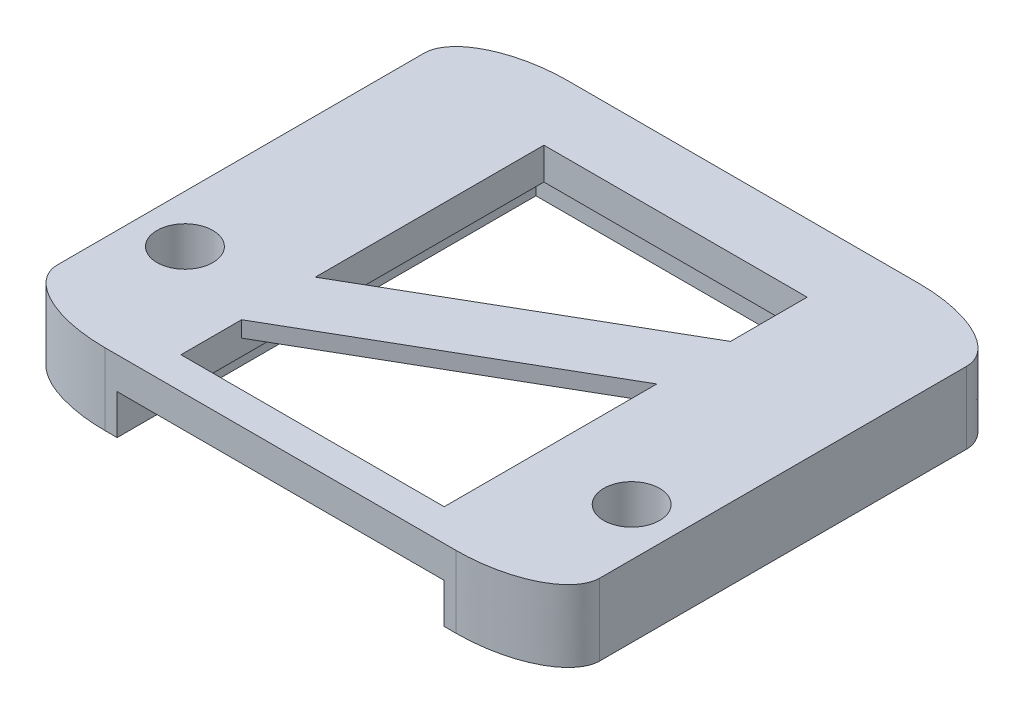
ISO-10303-21;
HEADER;
FILE_DESCRIPTION(('STEP AP214'),'2;1');
FILE_NAME('part.step','',(''),(''),'','','');
FILE_SCHEMA(('AUTOMOTIVE_DESIGN { 1 0 10303 214 1 1 1 1 }'));
ENDSEC;
DATA;
#1=APPLICATION_CONTEXT('core data for automotive mechanical design processes');
#2=APPLICATION_PROTOCOL_DEFINITION('international standard','automotive_design',2000,#1);
#3=PRODUCT_CONTEXT('',#1,'mechanical');
#4=PRODUCT('Part','Part','',(#3));
#5=PRODUCT_RELATED_PRODUCT_CATEGORY('part','',(#4));
#6=PRODUCT_DEFINITION_FORMATION('','',#4);
#7=PRODUCT_DEFINITION_CONTEXT('part definition',#1,'design');
#8=PRODUCT_DEFINITION('design','',#6,#7);
#9=PRODUCT_DEFINITION_SHAPE('','',#8);
#10=(LENGTH_UNIT() NAMED_UNIT(*) SI_UNIT(.MILLI.,.METRE.));
#11=(NAMED_UNIT(*) PLANE_ANGLE_UNIT() SI_UNIT($,.RADIAN.));
#12=(NAMED_UNIT(*) SI_UNIT($,.STERADIAN.) SOLID_ANGLE_UNIT());
#13=UNCERTAINTY_MEASURE_WITH_UNIT(LENGTH_MEASURE(1.E-05),#10,'distance_accuracy_value','');
#14=(GEOMETRIC_REPRESENTATION_CONTEXT(3) GLOBAL_UNCERTAINTY_ASSIGNED_CONTEXT((#13)) GLOBAL_UNIT_ASSIGNED_CONTEXT((#10,
#11,#12)) REPRESENTATION_CONTEXT('',''));
#15=CARTESIAN_POINT('',(0.,0.,0.));
#16=DIRECTION('',(0.,0.,1.));
#17=DIRECTION('',(1.,0.,0.));
#18=AXIS2_PLACEMENT_3D('',#15,#16,#17);
#19=CARTESIAN_POINT('',(1.70364564057485,2.,2.95080080756888));
#20=DIRECTION('',(-0.499999999999997,0.,-0.86602540378444));
#21=DIRECTION('',(-0.86602540378444,0.,0.499999999999997));
#22=AXIS2_PLACEMENT_3D('',#19,#20,#21);
#23=PLANE('',#22);
#24=DIRECTION('',(-0.86602540378444,0.,0.499999999999997));
#25=VECTOR('',#24,1.);
#26=CARTESIAN_POINT('',(1.70364564057485,1.,2.95080080756888));
#27=LINE('',#26,#25);
#28=CARTESIAN_POINT('',(8.25000000000001,1.,-0.828738644055887));
#29=VERTEX_POINT('',#28);
#30=CARTESIAN_POINT('',(-8.25,1.,8.69754079757288));
#31=VERTEX_POINT('',#30);
#32=EDGE_CURVE('E209',#29,#31,#27,.T.);
#33=ORIENTED_EDGE('',*,*,#32,.F.);
#34=DIRECTION('',(0.,-1.,0.));
#35=VECTOR('',#34,1.);
#36=CARTESIAN_POINT('',(8.25000000000001,2.,-0.82873864405589));
#37=LINE('',#36,#35);
#38=CARTESIAN_POINT('',(8.25000000000001,2.,-0.828738644055889));
#39=VERTEX_POINT('',#38);
#40=EDGE_CURVE('E236',#39,#29,#37,.T.);
#41=ORIENTED_EDGE('',*,*,#40,.F.);
#42=DIRECTION('',(0.86602540378444,0.,-0.499999999999997));
#43=VECTOR('',#42,1.);
#44=CARTESIAN_POINT('',(1.70364564057485,2.,2.95080080756888));
#45=LINE('',#44,#43);
#46=CARTESIAN_POINT('',(-8.25,2.,8.69754079757288));
#47=VERTEX_POINT('',#46);
#48=EDGE_CURVE('E234',#47,#39,#45,.T.);
#49=ORIENTED_EDGE('',*,*,#48,.F.);
#50=DIRECTION('',(0.,-1.,0.));
#51=VECTOR('',#50,1.);
#52=CARTESIAN_POINT('',(-8.25,2.,8.69754079757288));
#53=LINE('',#52,#51);
#54=EDGE_CURVE('E228',#47,#31,#53,.T.);
#55=ORIENTED_EDGE('',*,*,#54,.T.);
#56=EDGE_LOOP('',(#33,#41,#49,#55));
#57=FACE_BOUND('',#56,.T.);
#58=ADVANCED_FACE('F64',(#57),#23,.F.);
#59=CARTESIAN_POINT('',(-0.296354359425141,2.,-0.513300807568876));
#60=DIRECTION('',(-0.499999999999998,0.,-0.86602540378444));
#61=DIRECTION('',(-0.86602540378444,0.,0.499999999999998));
#62=AXIS2_PLACEMENT_3D('',#59,#60,#61);
#63=PLANE('',#62);
#64=DIRECTION('',(0.,-1.,0.));
#65=VECTOR('',#64,1.);
#66=CARTESIAN_POINT('',(8.25000000000001,2.,-5.44754079757289));
#67=LINE('',#66,#65);
#68=CARTESIAN_POINT('',(8.25000000000001,2.,-5.44754079757289));
#69=VERTEX_POINT('',#68);
#70=CARTESIAN_POINT('',(8.25000000000001,1.,-5.44754079757289));
#71=VERTEX_POINT('',#70);
#72=EDGE_CURVE('E623',#69,#71,#67,.T.);
#73=ORIENTED_EDGE('',*,*,#72,.T.);
#74=DIRECTION('',(-0.86602540378444,0.,0.499999999999998));
#75=VECTOR('',#74,1.);
#76=CARTESIAN_POINT('',(-0.296354359425141,1.,-0.513300807568876));
#77=LINE('',#76,#75);
#78=CARTESIAN_POINT('',(-8.25,1.,4.07873864405588));
#79=VERTEX_POINT('',#78);
#80=EDGE_CURVE('E221',#71,#79,#77,.T.);
#81=ORIENTED_EDGE('',*,*,#80,.T.);
#82=DIRECTION('',(0.,-1.,0.));
#83=VECTOR('',#82,1.);
#84=CARTESIAN_POINT('',(-8.25,2.,4.07873864405588));
#85=LINE('',#84,#83);
#86=CARTESIAN_POINT('',(-8.25,2.,4.07873864405588));
#87=VERTEX_POINT('',#86);
#88=EDGE_CURVE('E231',#87,#79,#85,.T.);
#89=ORIENTED_EDGE('',*,*,#88,.F.);
#90=DIRECTION('',(0.86602540378444,0.,-0.499999999999998));
#91=VECTOR('',#90,1.);
#92=CARTESIAN_POINT('',(-0.296354359425141,2.,-0.513300807568876));
#93=LINE('',#92,#91);
#94=EDGE_CURVE('E640',#87,#69,#93,.T.);
#95=ORIENTED_EDGE('',*,*,#94,.T.);
#96=EDGE_LOOP('',(#73,#81,#89,#95));
#97=FACE_BOUND('',#96,.T.);
#98=ADVANCED_FACE('F568',(#97),#63,.T.);
#99=CARTESIAN_POINT('',(0.,0.,0.));
#100=DIRECTION('',(0.,1.,0.));
#101=DIRECTION('',(0.,0.,1.));
#102=AXIS2_PLACEMENT_3D('',#99,#100,#101);
#103=PLANE('',#102);
#104=DIRECTION('',(-1.,0.,0.));
#105=VECTOR('',#104,1.);
#106=CARTESIAN_POINT('',(17.,0.,-11.75));
#107=LINE('',#106,#105);
#108=CARTESIAN_POINT('',(10.25,0.,-11.75));
#109=VERTEX_POINT('',#108);
#110=CARTESIAN_POINT('',(-10.25,0.,-11.75));
#111=VERTEX_POINT('',#110);
#112=EDGE_CURVE('E250',#109,#111,#107,.T.);
#113=ORIENTED_EDGE('',*,*,#112,.F.);
#114=DIRECTION('',(0.,0.,-1.));
#115=VECTOR('',#114,1.);
#116=CARTESIAN_POINT('',(10.25,0.,0.));
#117=LINE('',#116,#115);
#118=CARTESIAN_POINT('',(10.25,0.,14.5));
#119=VERTEX_POINT('',#118);
#120=EDGE_CURVE('E258',#119,#109,#117,.T.);
#121=ORIENTED_EDGE('',*,*,#120,.F.);
#122=DIRECTION('',(1.,0.,0.));
#123=VECTOR('',#122,1.);
#124=CARTESIAN_POINT('',(-17.,0.,14.5));
#125=LINE('',#124,#123);
#126=CARTESIAN_POINT('',(-10.25,0.,14.5));
#127=VERTEX_POINT('',#126);
#128=EDGE_CURVE('E288',#127,#119,#125,.T.);
#129=ORIENTED_EDGE('',*,*,#128,.F.);
#130=DIRECTION('',(0.,0.,1.));
#131=VECTOR('',#130,1.);
#132=CARTESIAN_POINT('',(-10.25,0.,0.));
#133=LINE('',#132,#131);
#134=EDGE_CURVE('E277',#111,#127,#133,.T.);
#135=ORIENTED_EDGE('',*,*,#134,.F.);
#136=EDGE_LOOP('',(#113,#121,#129,#135));
#137=FACE_BOUND('',#136,.T.);
#138=DIRECTION('',(0.,0.,-1.));
#139=VECTOR('',#138,1.);
#140=CARTESIAN_POINT('',(-8.25,0.,0.));
#141=LINE('',#140,#139);
#142=CARTESIAN_POINT('',(-8.25,0.,12.5));
#143=VERTEX_POINT('',#142);
#144=CARTESIAN_POINT('',(-8.24999999999999,0.,-10.25));
#145=VERTEX_POINT('',#144);
#146=EDGE_CURVE('E644',#143,#145,#141,.T.);
#147=ORIENTED_EDGE('',*,*,#146,.F.);
#148=DIRECTION('',(-1.,0.,0.));
#149=VECTOR('',#148,1.);
#150=CARTESIAN_POINT('',(0.,0.,12.5));
#151=LINE('',#150,#149);
#152=CARTESIAN_POINT('',(8.25000000000002,0.,12.5));
#153=VERTEX_POINT('',#152);
#154=EDGE_CURVE('E620',#153,#143,#151,.T.);
#155=ORIENTED_EDGE('',*,*,#154,.F.);
#156=DIRECTION('',(0.,0.,1.));
#157=VECTOR('',#156,1.);
#158=CARTESIAN_POINT('',(8.25000000000001,0.,0.));
#159=LINE('',#158,#157);
#160=CARTESIAN_POINT('',(8.25000000000001,0.,-10.25));
#161=VERTEX_POINT('',#160);
#162=EDGE_CURVE('E637',#161,#153,#159,.T.);
#163=ORIENTED_EDGE('',*,*,#162,.F.);
#164=DIRECTION('',(1.,0.,0.));
#165=VECTOR('',#164,1.);
#166=CARTESIAN_POINT('',(0.,0.,-10.25));
#167=LINE('',#166,#165);
#168=EDGE_CURVE('E641',#145,#161,#167,.T.);
#169=ORIENTED_EDGE('',*,*,#168,.F.);
#170=EDGE_LOOP('',(#147,#155,#163,#169));
#171=FACE_BOUND('',#170,.T.);
#172=ADVANCED_FACE('F336',(#137,#171),#103,.F.);
#173=CARTESIAN_POINT('',(0.,2.,0.));
#174=DIRECTION('',(0.,1.,0.));
#175=DIRECTION('',(0.,0.,1.));
#176=AXIS2_PLACEMENT_3D('',#173,#174,#175);
#177=PLANE('',#176);
#178=CARTESIAN_POINT('',(14.,2.,6.5));
#179=DIRECTION('',(0.,-1.,0.));
#180=DIRECTION('',(0.,0.,-1.));
#181=AXIS2_PLACEMENT_3D('',#178,#179,#180);
#182=CIRCLE('',#181,1.75);
#183=CARTESIAN_POINT('',(14.,2.,4.75));
#184=VERTEX_POINT('',#183);
#185=EDGE_CURVE('E646',#184,#184,#182,.T.);
#186=ORIENTED_EDGE('',*,*,#185,.T.);
#187=EDGE_LOOP('',(#186));
#188=FACE_BOUND('',#187,.T.);
#189=CARTESIAN_POINT('',(-14.,2.,6.5));
#190=DIRECTION('',(0.,-1.,0.));
#191=DIRECTION('',(0.,0.,-1.));
#192=AXIS2_PLACEMENT_3D('',#189,#190,#191);
#193=CIRCLE('',#192,1.75);
#194=CARTESIAN_POINT('',(-14.,2.,4.75));
#195=VERTEX_POINT('',#194);
#196=EDGE_CURVE('E658',#195,#195,#193,.T.);
#197=ORIENTED_EDGE('',*,*,#196,.T.);
#198=EDGE_LOOP('',(#197));
#199=FACE_BOUND('',#198,.T.);
#200=DIRECTION('',(0.,0.,-1.));
#201=VECTOR('',#200,1.);
#202=CARTESIAN_POINT('',(-8.25,2.,0.));
#203=LINE('',#202,#201);
#204=CARTESIAN_POINT('',(-8.25,2.,12.5));
#205=VERTEX_POINT('',#204);
#206=EDGE_CURVE('E622',#205,#47,#203,.T.);
#207=ORIENTED_EDGE('',*,*,#206,.T.);
#208=ORIENTED_EDGE('',*,*,#48,.T.);
#209=DIRECTION('',(0.,0.,1.));
#210=VECTOR('',#209,1.);
#211=CARTESIAN_POINT('',(8.25000000000001,2.,0.));
#212=LINE('',#211,#210);
#213=CARTESIAN_POINT('',(8.25000000000002,2.,12.5));
#214=VERTEX_POINT('',#213);
#215=EDGE_CURVE('E242',#39,#214,#212,.T.);
#216=ORIENTED_EDGE('',*,*,#215,.T.);
#217=DIRECTION('',(-1.,0.,0.));
#218=VECTOR('',#217,1.);
#219=CARTESIAN_POINT('',(0.,2.,12.5));
#220=LINE('',#219,#218);
#221=EDGE_CURVE('E237',#214,#205,#220,.T.);
#222=ORIENTED_EDGE('',*,*,#221,.T.);
#223=EDGE_LOOP('',(#207,#208,#216,#222));
#224=FACE_BOUND('',#223,.T.);
#225=DIRECTION('',(0.,0.,-1.));
#226=VECTOR('',#225,1.);
#227=CARTESIAN_POINT('',(-17.,2.,14.5));
#228=LINE('',#227,#226);
#229=CARTESIAN_POINT('',(-17.,2.,11.5));
#230=VERTEX_POINT('',#229);
#231=CARTESIAN_POINT('',(-17.,2.,-11.5));
#232=VERTEX_POINT('',#231);
#233=EDGE_CURVE('E295',#230,#232,#228,.T.);
#234=ORIENTED_EDGE('',*,*,#233,.F.);
#235=CARTESIAN_POINT('',(-11.,2.,14.5));
#236=CARTESIAN_POINT('',(-17.,2.,14.5));
#237=CARTESIAN_POINT('',(-17.,2.,11.5));
#238=(BOUNDED_CURVE() B_SPLINE_CURVE(2,(#235,#236,#237),.UNSPECIFIED.,.F.,
.F.) B_SPLINE_CURVE_WITH_KNOTS((3,3),(0.,1.),
.UNSPECIFIED.) CURVE() GEOMETRIC_REPRESENTATION_ITEM() RATIONAL_B_SPLINE_CURVE((1.,
0.707106781186547,1.)) REPRESENTATION_ITEM(''));
#239=CARTESIAN_POINT('',(-11.,2.,14.5));
#240=VERTEX_POINT('',#239);
#241=EDGE_CURVE('E381',#230,#240,#238,.F.);
#242=ORIENTED_EDGE('',*,*,#241,.T.);
#243=DIRECTION('',(1.,0.,0.));
#244=VECTOR('',#243,1.);
#245=CARTESIAN_POINT('',(-17.,2.,14.5));
#246=LINE('',#245,#244);
#247=CARTESIAN_POINT('',(11.,2.,14.5));
#248=VERTEX_POINT('',#247);
#249=EDGE_CURVE('E292',#240,#248,#246,.T.);
#250=ORIENTED_EDGE('',*,*,#249,.T.);
#251=CARTESIAN_POINT('',(17.,2.,11.5));
#252=CARTESIAN_POINT('',(17.,2.,14.5));
#253=CARTESIAN_POINT('',(11.,2.,14.5));
#254=(BOUNDED_CURVE() B_SPLINE_CURVE(2,(#251,#252,#253),.UNSPECIFIED.,.F.,
.F.) B_SPLINE_CURVE_WITH_KNOTS((3,3),(0.,1.),
.UNSPECIFIED.) CURVE() GEOMETRIC_REPRESENTATION_ITEM() RATIONAL_B_SPLINE_CURVE((1.,
0.707106781186547,1.)) REPRESENTATION_ITEM(''));
#255=CARTESIAN_POINT('',(17.,2.,11.5));
#256=VERTEX_POINT('',#255);
#257=EDGE_CURVE('E93',#248,#256,#254,.F.);
#258=ORIENTED_EDGE('',*,*,#257,.T.);
#259=DIRECTION('',(0.,0.,-1.));
#260=VECTOR('',#259,1.);
#261=CARTESIAN_POINT('',(17.,2.,14.5));
#262=LINE('',#261,#260);
#263=CARTESIAN_POINT('',(17.,2.,-11.5));
#264=VERTEX_POINT('',#263);
#265=EDGE_CURVE('E296',#256,#264,#262,.T.);
#266=ORIENTED_EDGE('',*,*,#265,.T.);
#267=CARTESIAN_POINT('',(11.,2.,-14.5));
#268=CARTESIAN_POINT('',(17.,2.,-14.5));
#269=CARTESIAN_POINT('',(17.,2.,-11.5));
#270=(BOUNDED_CURVE() B_SPLINE_CURVE(2,(#267,#268,#269),.UNSPECIFIED.,.F.,
.F.) B_SPLINE_CURVE_WITH_KNOTS((3,3),(0.,1.),
.UNSPECIFIED.) CURVE() GEOMETRIC_REPRESENTATION_ITEM() RATIONAL_B_SPLINE_CURVE((1.,
0.707106781186547,1.)) REPRESENTATION_ITEM(''));
#271=CARTESIAN_POINT('',(11.,2.,-14.5));
#272=VERTEX_POINT('',#271);
#273=EDGE_CURVE('E383',#264,#272,#270,.F.);
#274=ORIENTED_EDGE('',*,*,#273,.T.);
#275=DIRECTION('',(1.,0.,0.));
#276=VECTOR('',#275,1.);
#277=CARTESIAN_POINT('',(-17.,2.,-14.5));
#278=LINE('',#277,#276);
#279=CARTESIAN_POINT('',(-11.,2.,-14.5));
#280=VERTEX_POINT('',#279);
#281=EDGE_CURVE('E344',#280,#272,#278,.T.);
#282=ORIENTED_EDGE('',*,*,#281,.F.);
#283=CARTESIAN_POINT('',(-17.,2.,-11.5));
#284=CARTESIAN_POINT('',(-17.,2.,-14.5));
#285=CARTESIAN_POINT('',(-11.,2.,-14.5));
#286=(BOUNDED_CURVE() B_SPLINE_CURVE(2,(#283,#284,#285),.UNSPECIFIED.,.F.,
.F.) B_SPLINE_CURVE_WITH_KNOTS((3,3),(0.,1.),
.UNSPECIFIED.) CURVE() GEOMETRIC_REPRESENTATION_ITEM() RATIONAL_B_SPLINE_CURVE((1.,
0.707106781186548,1.)) REPRESENTATION_ITEM(''));
#287=EDGE_CURVE('E450',#280,#232,#286,.F.);
#288=ORIENTED_EDGE('',*,*,#287,.T.);
#289=EDGE_LOOP('',(#234,#242,#250,#258,#266,#274,#282,#288));
#290=FACE_BOUND('',#289,.T.);
#291=DIRECTION('',(0.,0.,1.));
#292=VECTOR('',#291,1.);
#293=CARTESIAN_POINT('',(8.25000000000001,2.,0.));
#294=LINE('',#293,#292);
#295=CARTESIAN_POINT('',(8.25000000000001,2.,-10.25));
#296=VERTEX_POINT('',#295);
#297=EDGE_CURVE('E631',#296,#69,#294,.T.);
#298=ORIENTED_EDGE('',*,*,#297,.T.);
#299=ORIENTED_EDGE('',*,*,#94,.F.);
#300=DIRECTION('',(0.,0.,-1.));
#301=VECTOR('',#300,1.);
#302=CARTESIAN_POINT('',(-8.25,2.,0.));
#303=LINE('',#302,#301);
#304=CARTESIAN_POINT('',(-8.24999999999999,2.,-10.25));
#305=VERTEX_POINT('',#304);
#306=EDGE_CURVE('E652',#87,#305,#303,.T.);
#307=ORIENTED_EDGE('',*,*,#306,.T.);
#308=DIRECTION('',(1.,0.,0.));
#309=VECTOR('',#308,1.);
#310=CARTESIAN_POINT('',(0.,2.,-10.25));
#311=LINE('',#310,#309);
#312=EDGE_CURVE('E649',#305,#296,#311,.T.);
#313=ORIENTED_EDGE('',*,*,#312,.T.);
#314=EDGE_LOOP('',(#298,#299,#307,#313));
#315=FACE_BOUND('',#314,.T.);
#316=ADVANCED_FACE('F442',(#188,#199,#224,#290,#315),#177,.T.);
#317=CARTESIAN_POINT('',(-17.,2.,-14.5));
#318=DIRECTION('',(0.,0.,-1.));
#319=DIRECTION('',(-1.,0.,0.));
#320=AXIS2_PLACEMENT_3D('',#317,#318,#319);
#321=PLANE('',#320);
#322=DIRECTION('',(1.,0.,0.));
#323=VECTOR('',#322,1.);
#324=CARTESIAN_POINT('',(17.,-2.5,-14.5));
#325=LINE('',#324,#323);
#326=CARTESIAN_POINT('',(-11.,-2.5,-14.5));
#327=VERTEX_POINT('',#326);
#328=CARTESIAN_POINT('',(11.,-2.5,-14.5));
#329=VERTEX_POINT('',#328);
#330=EDGE_CURVE('E249',#327,#329,#325,.T.);
#331=ORIENTED_EDGE('',*,*,#330,.F.);
#332=CARTESIAN_POINT('',(-11.,2.225,-14.5));
#333=CARTESIAN_POINT('',(-11.,0.575,-14.5));
#334=CARTESIAN_POINT('',(-11.,-1.075,-14.5));
#335=CARTESIAN_POINT('',(-11.,-2.725,-14.5));
#336=(BOUNDED_CURVE() B_SPLINE_CURVE(3,(#332,#333,#334,#335),.UNSPECIFIED.,.F.,
.F.) B_SPLINE_CURVE_WITH_KNOTS((4,4),(-0.000225,0.004725),
.UNSPECIFIED.) CURVE() GEOMETRIC_REPRESENTATION_ITEM() RATIONAL_B_SPLINE_CURVE((1.,1.,1.,1.)) REPRESENTATION_ITEM(''));
#337=EDGE_CURVE('E13',#327,#280,#336,.F.);
#338=ORIENTED_EDGE('',*,*,#337,.T.);
#339=ORIENTED_EDGE('',*,*,#281,.T.);
#340=CARTESIAN_POINT('',(11.,-2.725,-14.5));
#341=CARTESIAN_POINT('',(11.,-1.075,-14.5));
#342=CARTESIAN_POINT('',(11.,0.575000000000002,-14.5));
#343=CARTESIAN_POINT('',(11.,2.225,-14.5));
#344=(BOUNDED_CURVE() B_SPLINE_CURVE(3,(#340,#341,#342,#343),.UNSPECIFIED.,.F.,
.F.) B_SPLINE_CURVE_WITH_KNOTS((4,4),(-0.004725,0.000225),
.UNSPECIFIED.) CURVE() GEOMETRIC_REPRESENTATION_ITEM() RATIONAL_B_SPLINE_CURVE((1.,1.,1.,1.)) REPRESENTATION_ITEM(''));
#345=EDGE_CURVE('E78',#272,#329,#344,.F.);
#346=ORIENTED_EDGE('',*,*,#345,.T.);
#347=EDGE_LOOP('',(#331,#338,#339,#346));
#348=FACE_BOUND('',#347,.T.);
#349=ADVANCED_FACE('F335',(#348),#321,.T.);
#350=CARTESIAN_POINT('',(-17.,2.,14.5));
#351=DIRECTION('',(-1.,0.,0.));
#352=DIRECTION('',(0.,0.,1.));
#353=AXIS2_PLACEMENT_3D('',#350,#351,#352);
#354=PLANE('',#353);
#355=DIRECTION('',(0.,0.,-1.));
#356=VECTOR('',#355,1.);
#357=CARTESIAN_POINT('',(-17.,-2.5,0.));
#358=LINE('',#357,#356);
#359=CARTESIAN_POINT('',(-17.,-2.5,11.5));
#360=VERTEX_POINT('',#359);
#361=CARTESIAN_POINT('',(-17.,-2.5,-11.5));
#362=VERTEX_POINT('',#361);
#363=EDGE_CURVE('E259',#360,#362,#358,.T.);
#364=ORIENTED_EDGE('',*,*,#363,.F.);
#365=CARTESIAN_POINT('',(-17.,2.225,11.5));
#366=CARTESIAN_POINT('',(-17.,0.575000000000002,11.5));
#367=CARTESIAN_POINT('',(-17.,-1.075,11.5));
#368=CARTESIAN_POINT('',(-17.,-2.725,11.5));
#369=(BOUNDED_CURVE() B_SPLINE_CURVE(3,(#365,#366,#367,#368),.UNSPECIFIED.,.F.,
.F.) B_SPLINE_CURVE_WITH_KNOTS((4,4),(-0.004725,0.000225),
.UNSPECIFIED.) CURVE() GEOMETRIC_REPRESENTATION_ITEM() RATIONAL_B_SPLINE_CURVE((1.,1.,1.,1.)) REPRESENTATION_ITEM(''));
#370=EDGE_CURVE('E372',#360,#230,#369,.F.);
#371=ORIENTED_EDGE('',*,*,#370,.T.);
#372=ORIENTED_EDGE('',*,*,#233,.T.);
#373=CARTESIAN_POINT('',(-17.,-2.725,-11.5));
#374=CARTESIAN_POINT('',(-17.,-1.075,-11.5));
#375=CARTESIAN_POINT('',(-17.,0.575,-11.5));
#376=CARTESIAN_POINT('',(-17.,2.225,-11.5));
#377=(BOUNDED_CURVE() B_SPLINE_CURVE(3,(#373,#374,#375,#376),.UNSPECIFIED.,.F.,
.F.) B_SPLINE_CURVE_WITH_KNOTS((4,4),(-0.000225,0.004725),
.UNSPECIFIED.) CURVE() GEOMETRIC_REPRESENTATION_ITEM() RATIONAL_B_SPLINE_CURVE((1.,1.,1.,1.)) REPRESENTATION_ITEM(''));
#378=EDGE_CURVE('E317',#232,#362,#377,.F.);
#379=ORIENTED_EDGE('',*,*,#378,.T.);
#380=EDGE_LOOP('',(#364,#371,#372,#379));
#381=FACE_BOUND('',#380,.T.);
#382=ADVANCED_FACE('F324',(#381),#354,.T.);
#383=CARTESIAN_POINT('',(-17.,2.,14.5));
#384=DIRECTION('',(0.,0.,-1.));
#385=DIRECTION('',(-1.,0.,0.));
#386=AXIS2_PLACEMENT_3D('',#383,#384,#385);
#387=PLANE('',#386);
#388=ORIENTED_EDGE('',*,*,#249,.F.);
#389=CARTESIAN_POINT('',(-11.,-2.725,14.5));
#390=CARTESIAN_POINT('',(-11.,-1.075,14.5));
#391=CARTESIAN_POINT('',(-11.,0.575000000000002,14.5));
#392=CARTESIAN_POINT('',(-11.,2.225,14.5));
#393=(BOUNDED_CURVE() B_SPLINE_CURVE(3,(#389,#390,#391,#392),.UNSPECIFIED.,.F.,
.F.) B_SPLINE_CURVE_WITH_KNOTS((4,4),(-0.004725,0.000225),
.UNSPECIFIED.) CURVE() GEOMETRIC_REPRESENTATION_ITEM() RATIONAL_B_SPLINE_CURVE((1.,1.,1.,1.)) REPRESENTATION_ITEM(''));
#394=CARTESIAN_POINT('',(-11.,-2.5,14.5));
#395=VERTEX_POINT('',#394);
#396=EDGE_CURVE('E433',#240,#395,#393,.F.);
#397=ORIENTED_EDGE('',*,*,#396,.T.);
#398=DIRECTION('',(1.,0.,0.));
#399=VECTOR('',#398,1.);
#400=CARTESIAN_POINT('',(0.,-2.5,14.5));
#401=LINE('',#400,#399);
#402=CARTESIAN_POINT('',(-10.25,-2.5,14.5));
#403=VERTEX_POINT('',#402);
#404=EDGE_CURVE('E285',#395,#403,#401,.T.);
#405=ORIENTED_EDGE('',*,*,#404,.T.);
#406=DIRECTION('',(0.,1.,0.));
#407=VECTOR('',#406,1.);
#408=CARTESIAN_POINT('',(-10.25,-2.5,14.5));
#409=LINE('',#408,#407);
#410=EDGE_CURVE('E355',#403,#127,#409,.T.);
#411=ORIENTED_EDGE('',*,*,#410,.T.);
#412=ORIENTED_EDGE('',*,*,#128,.T.);
#413=DIRECTION('',(0.,1.,0.));
#414=VECTOR('',#413,1.);
#415=CARTESIAN_POINT('',(10.25,-2.5,14.5));
#416=LINE('',#415,#414);
#417=CARTESIAN_POINT('',(10.25,-2.5,14.5));
#418=VERTEX_POINT('',#417);
#419=EDGE_CURVE('E275',#418,#119,#416,.T.);
#420=ORIENTED_EDGE('',*,*,#419,.F.);
#421=DIRECTION('',(1.,0.,0.));
#422=VECTOR('',#421,1.);
#423=CARTESIAN_POINT('',(0.,-2.5,14.5));
#424=LINE('',#423,#422);
#425=CARTESIAN_POINT('',(11.,-2.5,14.5));
#426=VERTEX_POINT('',#425);
#427=EDGE_CURVE('E266',#418,#426,#424,.T.);
#428=ORIENTED_EDGE('',*,*,#427,.T.);
#429=CARTESIAN_POINT('',(11.,2.225,14.5));
#430=CARTESIAN_POINT('',(11.,0.575,14.5));
#431=CARTESIAN_POINT('',(11.,-1.075,14.5));
#432=CARTESIAN_POINT('',(11.,-2.725,14.5));
#433=(BOUNDED_CURVE() B_SPLINE_CURVE(3,(#429,#430,#431,#432),.UNSPECIFIED.,.F.,
.F.) B_SPLINE_CURVE_WITH_KNOTS((4,4),(-0.000225,0.004725),
.UNSPECIFIED.) CURVE() GEOMETRIC_REPRESENTATION_ITEM() RATIONAL_B_SPLINE_CURVE((1.,1.,1.,1.)) REPRESENTATION_ITEM(''));
#434=EDGE_CURVE('E307',#426,#248,#433,.F.);
#435=ORIENTED_EDGE('',*,*,#434,.T.);
#436=EDGE_LOOP('',(#388,#397,#405,#411,#412,#420,#428,#435));
#437=FACE_BOUND('',#436,.T.);
#438=ADVANCED_FACE('F334',(#437),#387,.F.);
#439=CARTESIAN_POINT('',(17.,2.,14.5));
#440=DIRECTION('',(-1.,0.,0.));
#441=DIRECTION('',(0.,0.,1.));
#442=AXIS2_PLACEMENT_3D('',#439,#440,#441);
#443=PLANE('',#442);
#444=ORIENTED_EDGE('',*,*,#265,.F.);
#445=CARTESIAN_POINT('',(17.,-2.725,11.5));
#446=CARTESIAN_POINT('',(17.,-1.075,11.5));
#447=CARTESIAN_POINT('',(17.,0.575,11.5));
#448=CARTESIAN_POINT('',(17.,2.225,11.5));
#449=(BOUNDED_CURVE() B_SPLINE_CURVE(3,(#445,#446,#447,#448),.UNSPECIFIED.,.F.,
.F.) B_SPLINE_CURVE_WITH_KNOTS((4,4),(-0.000225,0.004725),
.UNSPECIFIED.) CURVE() GEOMETRIC_REPRESENTATION_ITEM() RATIONAL_B_SPLINE_CURVE((1.,1.,1.,1.)) REPRESENTATION_ITEM(''));
#450=CARTESIAN_POINT('',(17.,-2.5,11.5));
#451=VERTEX_POINT('',#450);
#452=EDGE_CURVE('E448',#256,#451,#449,.F.);
#453=ORIENTED_EDGE('',*,*,#452,.T.);
#454=DIRECTION('',(0.,0.,-1.));
#455=VECTOR('',#454,1.);
#456=CARTESIAN_POINT('',(17.,-2.5,0.));
#457=LINE('',#456,#455);
#458=CARTESIAN_POINT('',(17.,-2.5,-11.5));
#459=VERTEX_POINT('',#458);
#460=EDGE_CURVE('E262',#451,#459,#457,.T.);
#461=ORIENTED_EDGE('',*,*,#460,.T.);
#462=CARTESIAN_POINT('',(17.,2.225,-11.5));
#463=CARTESIAN_POINT('',(17.,0.575000000000002,-11.5));
#464=CARTESIAN_POINT('',(17.,-1.075,-11.5));
#465=CARTESIAN_POINT('',(17.,-2.725,-11.5));
#466=(BOUNDED_CURVE() B_SPLINE_CURVE(3,(#462,#463,#464,#465),.UNSPECIFIED.,.F.,
.F.) B_SPLINE_CURVE_WITH_KNOTS((4,4),(-0.004725,0.000225),
.UNSPECIFIED.) CURVE() GEOMETRIC_REPRESENTATION_ITEM() RATIONAL_B_SPLINE_CURVE((1.,1.,1.,1.)) REPRESENTATION_ITEM(''));
#467=EDGE_CURVE('E85',#459,#264,#466,.F.);
#468=ORIENTED_EDGE('',*,*,#467,.T.);
#469=EDGE_LOOP('',(#444,#453,#461,#468));
#470=FACE_BOUND('',#469,.T.);
#471=ADVANCED_FACE('F558',(#470),#443,.F.);
#472=CARTESIAN_POINT('',(-10.25,-2.5,0.));
#473=DIRECTION('',(-1.,0.,0.));
#474=DIRECTION('',(0.,0.,1.));
#475=AXIS2_PLACEMENT_3D('',#472,#473,#474);
#476=PLANE('',#475);
#477=ORIENTED_EDGE('',*,*,#134,.T.);
#478=ORIENTED_EDGE('',*,*,#410,.F.);
#479=DIRECTION('',(0.,0.,1.));
#480=VECTOR('',#479,1.);
#481=CARTESIAN_POINT('',(-10.25,-2.5,0.));
#482=LINE('',#481,#480);
#483=CARTESIAN_POINT('',(-10.25,-2.5,-11.75));
#484=VERTEX_POINT('',#483);
#485=EDGE_CURVE('E282',#484,#403,#482,.T.);
#486=ORIENTED_EDGE('',*,*,#485,.F.);
#487=DIRECTION('',(0.,1.,0.));
#488=VECTOR('',#487,1.);
#489=CARTESIAN_POINT('',(-10.25,-2.5,-11.75));
#490=LINE('',#489,#488);
#491=EDGE_CURVE('E358',#484,#111,#490,.T.);
#492=ORIENTED_EDGE('',*,*,#491,.T.);
#493=EDGE_LOOP('',(#477,#478,#486,#492));
#494=FACE_BOUND('',#493,.T.);
#495=ADVANCED_FACE('F560',(#494),#476,.F.);
#496=CARTESIAN_POINT('',(0.,-2.5,0.));
#497=DIRECTION('',(0.,1.,0.));
#498=DIRECTION('',(0.,0.,1.));
#499=AXIS2_PLACEMENT_3D('',#496,#497,#498);
#500=PLANE('',#499);
#501=CARTESIAN_POINT('',(14.,-2.5,6.5));
#502=DIRECTION('',(0.,-1.,0.));
#503=DIRECTION('',(0.,0.,-1.));
#504=AXIS2_PLACEMENT_3D('',#501,#502,#503);
#505=CIRCLE('',#504,1.75);
#506=CARTESIAN_POINT('',(14.,-2.5,4.75));
#507=VERTEX_POINT('',#506);
#508=EDGE_CURVE('E661',#507,#507,#505,.T.);
#509=ORIENTED_EDGE('',*,*,#508,.F.);
#510=EDGE_LOOP('',(#509));
#511=FACE_BOUND('',#510,.T.);
#512=CARTESIAN_POINT('',(-14.,-2.5,6.5));
#513=DIRECTION('',(0.,-1.,0.));
#514=DIRECTION('',(0.,0.,-1.));
#515=AXIS2_PLACEMENT_3D('',#512,#513,#514);
#516=CIRCLE('',#515,1.75);
#517=CARTESIAN_POINT('',(-14.,-2.5,4.75));
#518=VERTEX_POINT('',#517);
#519=EDGE_CURVE('E220',#518,#518,#516,.T.);
#520=ORIENTED_EDGE('',*,*,#519,.F.);
#521=EDGE_LOOP('',(#520));
#522=FACE_BOUND('',#521,.T.);
#523=ORIENTED_EDGE('',*,*,#404,.F.);
#524=CARTESIAN_POINT('',(-17.,-2.5,11.5));
#525=CARTESIAN_POINT('',(-17.,-2.5,14.5));
#526=CARTESIAN_POINT('',(-11.,-2.5,14.5));
#527=(BOUNDED_CURVE() B_SPLINE_CURVE(2,(#524,#525,#526),.UNSPECIFIED.,.F.,
.F.) B_SPLINE_CURVE_WITH_KNOTS((3,3),(0.,1.),
.UNSPECIFIED.) CURVE() GEOMETRIC_REPRESENTATION_ITEM() RATIONAL_B_SPLINE_CURVE((1.,
0.707106781186547,1.)) REPRESENTATION_ITEM(''));
#528=EDGE_CURVE('E370',#395,#360,#527,.F.);
#529=ORIENTED_EDGE('',*,*,#528,.T.);
#530=ORIENTED_EDGE('',*,*,#363,.T.);
#531=CARTESIAN_POINT('',(-11.,-2.5,-14.5));
#532=CARTESIAN_POINT('',(-17.,-2.5,-14.5));
#533=CARTESIAN_POINT('',(-17.,-2.5,-11.5));
#534=(BOUNDED_CURVE() B_SPLINE_CURVE(2,(#531,#532,#533),.UNSPECIFIED.,.F.,
.F.) B_SPLINE_CURVE_WITH_KNOTS((3,3),(0.,1.),
.UNSPECIFIED.) CURVE() GEOMETRIC_REPRESENTATION_ITEM() RATIONAL_B_SPLINE_CURVE((1.,
0.707106781186548,1.)) REPRESENTATION_ITEM(''));
#535=EDGE_CURVE('E367',#362,#327,#534,.F.);
#536=ORIENTED_EDGE('',*,*,#535,.T.);
#537=ORIENTED_EDGE('',*,*,#330,.T.);
#538=CARTESIAN_POINT('',(17.,-2.5,-11.5));
#539=CARTESIAN_POINT('',(17.,-2.5,-14.5));
#540=CARTESIAN_POINT('',(11.,-2.5,-14.5));
#541=(BOUNDED_CURVE() B_SPLINE_CURVE(2,(#538,#539,#540),.UNSPECIFIED.,.F.,
.F.) B_SPLINE_CURVE_WITH_KNOTS((3,3),(0.,1.),
.UNSPECIFIED.) CURVE() GEOMETRIC_REPRESENTATION_ITEM() RATIONAL_B_SPLINE_CURVE((1.,
0.707106781186547,1.)) REPRESENTATION_ITEM(''));
#542=EDGE_CURVE('E437',#329,#459,#541,.F.);
#543=ORIENTED_EDGE('',*,*,#542,.T.);
#544=ORIENTED_EDGE('',*,*,#460,.F.);
#545=CARTESIAN_POINT('',(11.,-2.5,14.5));
#546=CARTESIAN_POINT('',(17.,-2.5,14.5));
#547=CARTESIAN_POINT('',(17.,-2.5,11.5));
#548=(BOUNDED_CURVE() B_SPLINE_CURVE(2,(#545,#546,#547),.UNSPECIFIED.,.F.,
.F.) B_SPLINE_CURVE_WITH_KNOTS((3,3),(0.,1.),
.UNSPECIFIED.) CURVE() GEOMETRIC_REPRESENTATION_ITEM() RATIONAL_B_SPLINE_CURVE((1.,
0.707106781186547,1.)) REPRESENTATION_ITEM(''));
#549=EDGE_CURVE('E605',#451,#426,#548,.F.);
#550=ORIENTED_EDGE('',*,*,#549,.T.);
#551=ORIENTED_EDGE('',*,*,#427,.F.);
#552=DIRECTION('',(0.,0.,-1.));
#553=VECTOR('',#552,1.);
#554=CARTESIAN_POINT('',(10.25,-2.5,0.));
#555=LINE('',#554,#553);
#556=CARTESIAN_POINT('',(10.25,-2.5,-11.75));
#557=VERTEX_POINT('',#556);
#558=EDGE_CURVE('E274',#418,#557,#555,.T.);
#559=ORIENTED_EDGE('',*,*,#558,.T.);
#560=DIRECTION('',(-1.,0.,0.));
#561=VECTOR('',#560,1.);
#562=CARTESIAN_POINT('',(17.,-2.5,-11.75));
#563=LINE('',#562,#561);
#564=EDGE_CURVE('E246',#557,#484,#563,.T.);
#565=ORIENTED_EDGE('',*,*,#564,.T.);
#566=ORIENTED_EDGE('',*,*,#485,.T.);
#567=EDGE_LOOP('',(#523,#529,#530,#536,#537,#543,#544,#550,#551,#559,#565,#566));
#568=FACE_BOUND('',#567,.T.);
#569=ADVANCED_FACE('F366',(#511,#522,#568),#500,.F.);
#570=CARTESIAN_POINT('',(10.25,-2.5,0.));
#571=DIRECTION('',(1.,0.,0.));
#572=DIRECTION('',(0.,0.,-1.));
#573=AXIS2_PLACEMENT_3D('',#570,#571,#572);
#574=PLANE('',#573);
#575=ORIENTED_EDGE('',*,*,#120,.T.);
#576=DIRECTION('',(0.,1.,0.));
#577=VECTOR('',#576,1.);
#578=CARTESIAN_POINT('',(10.25,-2.5,-11.75));
#579=LINE('',#578,#577);
#580=EDGE_CURVE('E265',#557,#109,#579,.T.);
#581=ORIENTED_EDGE('',*,*,#580,.F.);
#582=ORIENTED_EDGE('',*,*,#558,.F.);
#583=ORIENTED_EDGE('',*,*,#419,.T.);
#584=EDGE_LOOP('',(#575,#581,#582,#583));
#585=FACE_BOUND('',#584,.T.);
#586=ADVANCED_FACE('F581',(#585),#574,.F.);
#587=CARTESIAN_POINT('',(17.,-2.5,-11.75));
#588=DIRECTION('',(0.,0.,-1.));
#589=DIRECTION('',(-1.,0.,0.));
#590=AXIS2_PLACEMENT_3D('',#587,#588,#589);
#591=PLANE('',#590);
#592=ORIENTED_EDGE('',*,*,#112,.T.);
#593=ORIENTED_EDGE('',*,*,#491,.F.);
#594=ORIENTED_EDGE('',*,*,#564,.F.);
#595=ORIENTED_EDGE('',*,*,#580,.T.);
#596=EDGE_LOOP('',(#592,#593,#594,#595));
#597=FACE_BOUND('',#596,.T.);
#598=ADVANCED_FACE('F578',(#597),#591,.F.);
#599=CARTESIAN_POINT('',(0.,2.,12.5));
#600=DIRECTION('',(0.,0.,1.));
#601=DIRECTION('',(1.,0.,0.));
#602=AXIS2_PLACEMENT_3D('',#599,#600,#601);
#603=PLANE('',#602);
#604=ORIENTED_EDGE('',*,*,#154,.T.);
#605=DIRECTION('',(0.,-1.,0.));
#606=VECTOR('',#605,1.);
#607=CARTESIAN_POINT('',(-8.25,2.,12.5));
#608=LINE('',#607,#606);
#609=EDGE_CURVE('E616',#205,#143,#608,.T.);
#610=ORIENTED_EDGE('',*,*,#609,.F.);
#611=ORIENTED_EDGE('',*,*,#221,.F.);
#612=DIRECTION('',(0.,-1.,0.));
#613=VECTOR('',#612,1.);
#614=CARTESIAN_POINT('',(8.25000000000002,2.,12.5));
#615=LINE('',#614,#613);
#616=EDGE_CURVE('E239',#214,#153,#615,.T.);
#617=ORIENTED_EDGE('',*,*,#616,.T.);
#618=EDGE_LOOP('',(#604,#610,#611,#617));
#619=FACE_BOUND('',#618,.T.);
#620=ADVANCED_FACE('F577',(#619),#603,.F.);
#621=CARTESIAN_POINT('',(8.25000000000001,2.,0.));
#622=DIRECTION('',(1.,0.,0.));
#623=DIRECTION('',(0.,0.,-1.));
#624=AXIS2_PLACEMENT_3D('',#621,#622,#623);
#625=PLANE('',#624);
#626=ORIENTED_EDGE('',*,*,#162,.T.);
#627=ORIENTED_EDGE('',*,*,#616,.F.);
#628=ORIENTED_EDGE('',*,*,#215,.F.);
#629=ORIENTED_EDGE('',*,*,#40,.T.);
#630=DIRECTION('',(0.,0.,1.));
#631=VECTOR('',#630,1.);
#632=CARTESIAN_POINT('',(8.25000000000001,1.,12.5));
#633=LINE('',#632,#631);
#634=EDGE_CURVE('E215',#71,#29,#633,.T.);
#635=ORIENTED_EDGE('',*,*,#634,.F.);
#636=ORIENTED_EDGE('',*,*,#72,.F.);
#637=ORIENTED_EDGE('',*,*,#297,.F.);
#638=DIRECTION('',(0.,-1.,0.));
#639=VECTOR('',#638,1.);
#640=CARTESIAN_POINT('',(8.25000000000001,2.,-10.25));
#641=LINE('',#640,#639);
#642=EDGE_CURVE('E633',#296,#161,#641,.T.);
#643=ORIENTED_EDGE('',*,*,#642,.T.);
#644=EDGE_LOOP('',(#626,#627,#628,#629,#635,#636,#637,#643));
#645=FACE_BOUND('',#644,.T.);
#646=ADVANCED_FACE('F669',(#645),#625,.F.);
#647=CARTESIAN_POINT('',(0.,2.,-10.25));
#648=DIRECTION('',(0.,0.,-1.));
#649=DIRECTION('',(-1.,0.,0.));
#650=AXIS2_PLACEMENT_3D('',#647,#648,#649);
#651=PLANE('',#650);
#652=ORIENTED_EDGE('',*,*,#168,.T.);
#653=ORIENTED_EDGE('',*,*,#642,.F.);
#654=ORIENTED_EDGE('',*,*,#312,.F.);
#655=DIRECTION('',(0.,-1.,0.));
#656=VECTOR('',#655,1.);
#657=CARTESIAN_POINT('',(-8.24999999999999,2.,-10.25));
#658=LINE('',#657,#656);
#659=EDGE_CURVE('E630',#305,#145,#658,.T.);
#660=ORIENTED_EDGE('',*,*,#659,.T.);
#661=EDGE_LOOP('',(#652,#653,#654,#660));
#662=FACE_BOUND('',#661,.T.);
#663=ADVANCED_FACE('F680',(#662),#651,.F.);
#664=CARTESIAN_POINT('',(-8.25,2.,0.));
#665=DIRECTION('',(-1.,0.,0.));
#666=DIRECTION('',(0.,0.,1.));
#667=AXIS2_PLACEMENT_3D('',#664,#665,#666);
#668=PLANE('',#667);
#669=ORIENTED_EDGE('',*,*,#146,.T.);
#670=ORIENTED_EDGE('',*,*,#659,.F.);
#671=ORIENTED_EDGE('',*,*,#306,.F.);
#672=ORIENTED_EDGE('',*,*,#88,.T.);
#673=DIRECTION('',(0.,0.,-1.));
#674=VECTOR('',#673,1.);
#675=CARTESIAN_POINT('',(-8.25,1.,12.5));
#676=LINE('',#675,#674);
#677=EDGE_CURVE('E212',#31,#79,#676,.T.);
#678=ORIENTED_EDGE('',*,*,#677,.F.);
#679=ORIENTED_EDGE('',*,*,#54,.F.);
#680=ORIENTED_EDGE('',*,*,#206,.F.);
#681=ORIENTED_EDGE('',*,*,#609,.T.);
#682=EDGE_LOOP('',(#669,#670,#671,#672,#678,#679,#680,#681));
#683=FACE_BOUND('',#682,.T.);
#684=ADVANCED_FACE('F226',(#683),#668,.F.);
#685=CARTESIAN_POINT('',(-14.,2.,6.5));
#686=DIRECTION('',(0.,-1.,0.));
#687=DIRECTION('',(0.,0.,-1.));
#688=AXIS2_PLACEMENT_3D('',#685,#686,#687);
#689=CYLINDRICAL_SURFACE('',#688,1.75);
#690=ORIENTED_EDGE('',*,*,#196,.F.);
#691=EDGE_LOOP('',(#690));
#692=FACE_BOUND('',#691,.T.);
#693=ORIENTED_EDGE('',*,*,#519,.T.);
#694=EDGE_LOOP('',(#693));
#695=FACE_BOUND('',#694,.T.);
#696=ADVANCED_FACE('F687',(#692,#695),#689,.F.);
#697=CARTESIAN_POINT('',(14.,2.,6.5));
#698=DIRECTION('',(0.,-1.,0.));
#699=DIRECTION('',(0.,0.,-1.));
#700=AXIS2_PLACEMENT_3D('',#697,#698,#699);
#701=CYLINDRICAL_SURFACE('',#700,1.75);
#702=ORIENTED_EDGE('',*,*,#185,.F.);
#703=EDGE_LOOP('',(#702));
#704=FACE_BOUND('',#703,.T.);
#705=ORIENTED_EDGE('',*,*,#508,.T.);
#706=EDGE_LOOP('',(#705));
#707=FACE_BOUND('',#706,.T.);
#708=ADVANCED_FACE('F693',(#704,#707),#701,.F.);
#709=CARTESIAN_POINT('',(0.,1.,0.));
#710=DIRECTION('',(0.,-1.,0.));
#711=DIRECTION('',(0.,0.,-1.));
#712=AXIS2_PLACEMENT_3D('',#709,#710,#711);
#713=PLANE('',#712);
#714=ORIENTED_EDGE('',*,*,#32,.T.);
#715=ORIENTED_EDGE('',*,*,#677,.T.);
#716=ORIENTED_EDGE('',*,*,#80,.F.);
#717=ORIENTED_EDGE('',*,*,#634,.T.);
#718=EDGE_LOOP('',(#714,#715,#716,#717));
#719=FACE_BOUND('',#718,.T.);
#720=ADVANCED_FACE('F211',(#719),#713,.T.);
#721=CARTESIAN_POINT('',(-17.,-2.725,11.5));
#722=CARTESIAN_POINT('',(-17.,-1.075,11.5));
#723=CARTESIAN_POINT('',(-17.,0.575000000000002,11.5));
#724=CARTESIAN_POINT('',(-17.,2.225,11.5));
#725=CARTESIAN_POINT('',(-17.,-2.725,14.5));
#726=CARTESIAN_POINT('',(-17.,-1.075,14.5));
#727=CARTESIAN_POINT('',(-17.,0.575000000000003,14.5));
#728=CARTESIAN_POINT('',(-17.,2.225,14.5));
#729=CARTESIAN_POINT('',(-11.,-2.725,14.5));
#730=CARTESIAN_POINT('',(-11.,-1.075,14.5));
#731=CARTESIAN_POINT('',(-11.,0.575000000000002,14.5));
#732=CARTESIAN_POINT('',(-11.,2.225,14.5));
#733=(BOUNDED_SURFACE() B_SPLINE_SURFACE(2,3,((#721,#722,#723,#724),(#725,#726,#727,#728),(#729,
#730,#731,#732)),.UNSPECIFIED.,.F.,.F.,.F.) B_SPLINE_SURFACE_WITH_KNOTS((3,3),(4,4),(0.,1.),
(-0.004725,0.000225),
.UNSPECIFIED.) GEOMETRIC_REPRESENTATION_ITEM() RATIONAL_B_SPLINE_SURFACE(((1.,1.,1.,1.),
(0.707106781186547,0.707106781186547,0.707106781186547,0.707106781186547),(1.,1.,1.,1.))) REPRESENTATION_ITEM('') SURFACE());
#734=ORIENTED_EDGE('',*,*,#241,.F.);
#735=ORIENTED_EDGE('',*,*,#370,.F.);
#736=ORIENTED_EDGE('',*,*,#528,.F.);
#737=ORIENTED_EDGE('',*,*,#396,.F.);
#738=EDGE_LOOP('',(#734,#735,#736,#737));
#739=FACE_BOUND('',#738,.T.);
#740=ADVANCED_FACE('F377',(#739),#733,.T.);
#741=CARTESIAN_POINT('',(17.,2.225,11.5));
#742=CARTESIAN_POINT('',(17.,0.575,11.5));
#743=CARTESIAN_POINT('',(17.,-1.075,11.5));
#744=CARTESIAN_POINT('',(17.,-2.725,11.5));
#745=CARTESIAN_POINT('',(17.,2.225,14.5));
#746=CARTESIAN_POINT('',(17.,0.575,14.5));
#747=CARTESIAN_POINT('',(17.,-1.075,14.5));
#748=CARTESIAN_POINT('',(17.,-2.725,14.5));
#749=CARTESIAN_POINT('',(11.,2.225,14.5));
#750=CARTESIAN_POINT('',(11.,0.575,14.5));
#751=CARTESIAN_POINT('',(11.,-1.075,14.5));
#752=CARTESIAN_POINT('',(11.,-2.725,14.5));
#753=(BOUNDED_SURFACE() B_SPLINE_SURFACE(2,3,((#741,#742,#743,#744),(#745,#746,#747,#748),(#749,
#750,#751,#752)),.UNSPECIFIED.,.F.,.F.,.F.) B_SPLINE_SURFACE_WITH_KNOTS((3,3),(4,4),(0.,1.),
(-0.000225,0.004725),
.UNSPECIFIED.) GEOMETRIC_REPRESENTATION_ITEM() RATIONAL_B_SPLINE_SURFACE(((1.,1.,1.,1.),
(0.707106781186547,0.707106781186547,0.707106781186547,0.707106781186547),(1.,1.,1.,1.))) REPRESENTATION_ITEM('') SURFACE());
#754=ORIENTED_EDGE('',*,*,#257,.F.);
#755=ORIENTED_EDGE('',*,*,#434,.F.);
#756=ORIENTED_EDGE('',*,*,#549,.F.);
#757=ORIENTED_EDGE('',*,*,#452,.F.);
#758=EDGE_LOOP('',(#754,#755,#756,#757));
#759=FACE_BOUND('',#758,.T.);
#760=ADVANCED_FACE('F408',(#759),#753,.T.);
#761=CARTESIAN_POINT('',(-17.,2.225,-11.5));
#762=CARTESIAN_POINT('',(-17.,0.575,-11.5));
#763=CARTESIAN_POINT('',(-17.,-1.075,-11.5));
#764=CARTESIAN_POINT('',(-17.,-2.725,-11.5));
#765=CARTESIAN_POINT('',(-17.,2.225,-14.5));
#766=CARTESIAN_POINT('',(-17.,0.575,-14.5));
#767=CARTESIAN_POINT('',(-17.,-1.075,-14.5));
#768=CARTESIAN_POINT('',(-17.,-2.725,-14.5));
#769=CARTESIAN_POINT('',(-11.,2.225,-14.5));
#770=CARTESIAN_POINT('',(-11.,0.575,-14.5));
#771=CARTESIAN_POINT('',(-11.,-1.075,-14.5));
#772=CARTESIAN_POINT('',(-11.,-2.725,-14.5));
#773=(BOUNDED_SURFACE() B_SPLINE_SURFACE(2,3,((#761,#762,#763,#764),(#765,#766,#767,#768),(#769,
#770,#771,#772)),.UNSPECIFIED.,.F.,.F.,.F.) B_SPLINE_SURFACE_WITH_KNOTS((3,3),(4,4),(0.,1.),
(-0.000225,0.004725),
.UNSPECIFIED.) GEOMETRIC_REPRESENTATION_ITEM() RATIONAL_B_SPLINE_SURFACE(((1.,1.,1.,1.),
(0.707106781186548,0.707106781186548,0.707106781186548,0.707106781186548),(1.,1.,1.,1.))) REPRESENTATION_ITEM('') SURFACE());
#774=ORIENTED_EDGE('',*,*,#287,.F.);
#775=ORIENTED_EDGE('',*,*,#337,.F.);
#776=ORIENTED_EDGE('',*,*,#535,.F.);
#777=ORIENTED_EDGE('',*,*,#378,.F.);
#778=EDGE_LOOP('',(#774,#775,#776,#777));
#779=FACE_BOUND('',#778,.T.);
#780=ADVANCED_FACE('F479',(#779),#773,.T.);
#781=CARTESIAN_POINT('',(17.,-2.725,-11.5));
#782=CARTESIAN_POINT('',(17.,-1.075,-11.5));
#783=CARTESIAN_POINT('',(17.,0.575000000000002,-11.5));
#784=CARTESIAN_POINT('',(17.,2.225,-11.5));
#785=CARTESIAN_POINT('',(17.,-2.725,-14.5));
#786=CARTESIAN_POINT('',(17.,-1.075,-14.5));
#787=CARTESIAN_POINT('',(17.,0.575000000000003,-14.5));
#788=CARTESIAN_POINT('',(17.,2.225,-14.5));
#789=CARTESIAN_POINT('',(11.,-2.725,-14.5));
#790=CARTESIAN_POINT('',(11.,-1.075,-14.5));
#791=CARTESIAN_POINT('',(11.,0.575000000000002,-14.5));
#792=CARTESIAN_POINT('',(11.,2.225,-14.5));
#793=(BOUNDED_SURFACE() B_SPLINE_SURFACE(2,3,((#781,#782,#783,#784),(#785,#786,#787,#788),(#789,
#790,#791,#792)),.UNSPECIFIED.,.F.,.F.,.F.) B_SPLINE_SURFACE_WITH_KNOTS((3,3),(4,4),(0.,1.),
(-0.004725,0.000225),
.UNSPECIFIED.) GEOMETRIC_REPRESENTATION_ITEM() RATIONAL_B_SPLINE_SURFACE(((1.,1.,1.,1.),
(0.707106781186547,0.707106781186547,0.707106781186547,0.707106781186547),(1.,1.,1.,1.))) REPRESENTATION_ITEM('') SURFACE());
#794=ORIENTED_EDGE('',*,*,#273,.F.);
#795=ORIENTED_EDGE('',*,*,#467,.F.);
#796=ORIENTED_EDGE('',*,*,#542,.F.);
#797=ORIENTED_EDGE('',*,*,#345,.F.);
#798=EDGE_LOOP('',(#794,#795,#796,#797));
#799=FACE_BOUND('',#798,.T.);
#800=ADVANCED_FACE('F67',(#799),#793,.T.);
#801=CLOSED_SHELL('',(#58,#98,#172,#316,#349,#382,#438,#471,#495,#569,#586,#598,#620,#646,#663,
#684,#696,#708,#720,#740,#760,#780,#800));
#802=MANIFOLD_SOLID_BREP('B2',#801);
#803=ADVANCED_BREP_SHAPE_REPRESENTATION('',(#18,#802),#14);
#804=SHAPE_DEFINITION_REPRESENTATION(#9,#803);
ENDSEC;
END-ISO-10303-21;
